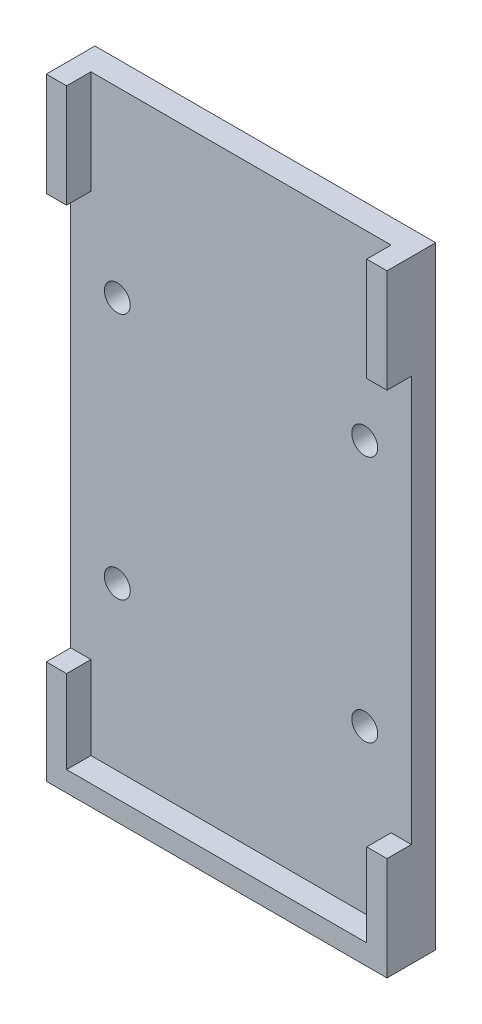
ISO-10303-21;
HEADER;
FILE_DESCRIPTION(('STEP AP214'),'2;1');
FILE_NAME('part.step','',(''),(''),'','','');
FILE_SCHEMA(('AUTOMOTIVE_DESIGN { 1 0 10303 214 1 1 1 1 }'));
ENDSEC;
DATA;
#1=APPLICATION_CONTEXT('core data for automotive mechanical design processes');
#2=APPLICATION_PROTOCOL_DEFINITION('international standard','automotive_design',2000,#1);
#3=PRODUCT_CONTEXT('',#1,'mechanical');
#4=PRODUCT('Part','Part','',(#3));
#5=PRODUCT_RELATED_PRODUCT_CATEGORY('part','',(#4));
#6=PRODUCT_DEFINITION_FORMATION('','',#4);
#7=PRODUCT_DEFINITION_CONTEXT('part definition',#1,'design');
#8=PRODUCT_DEFINITION('design','',#6,#7);
#9=PRODUCT_DEFINITION_SHAPE('','',#8);
#10=(LENGTH_UNIT() NAMED_UNIT(*) SI_UNIT(.MILLI.,.METRE.));
#11=(NAMED_UNIT(*) PLANE_ANGLE_UNIT() SI_UNIT($,.RADIAN.));
#12=(NAMED_UNIT(*) SI_UNIT($,.STERADIAN.) SOLID_ANGLE_UNIT());
#13=UNCERTAINTY_MEASURE_WITH_UNIT(LENGTH_MEASURE(1.E-05),#10,'distance_accuracy_value','');
#14=(GEOMETRIC_REPRESENTATION_CONTEXT(3) GLOBAL_UNCERTAINTY_ASSIGNED_CONTEXT((#13)) GLOBAL_UNIT_ASSIGNED_CONTEXT((#10,
#11,#12)) REPRESENTATION_CONTEXT('',''));
#15=CARTESIAN_POINT('',(0.,0.,0.));
#16=DIRECTION('',(0.,0.,1.));
#17=DIRECTION('',(1.,0.,0.));
#18=AXIS2_PLACEMENT_3D('',#15,#16,#17);
#19=CARTESIAN_POINT('',(0.,0.,3.));
#20=DIRECTION('',(0.,0.,-1.));
#21=DIRECTION('',(-1.,0.,0.));
#22=AXIS2_PLACEMENT_3D('',#19,#20,#21);
#23=PLANE('',#22);
#24=DIRECTION('',(-1.,0.,0.));
#25=VECTOR('',#24,1.);
#26=CARTESIAN_POINT('',(39.5,10.25,3.));
#27=LINE('',#26,#25);
#28=CARTESIAN_POINT('',(39.5,10.25,3.));
#29=VERTEX_POINT('',#28);
#30=CARTESIAN_POINT('',(37.,10.25,3.));
#31=VERTEX_POINT('',#30);
#32=EDGE_CURVE('E157',#29,#31,#27,.T.);
#33=ORIENTED_EDGE('',*,*,#32,.T.);
#34=DIRECTION('',(0.,-1.,0.));
#35=VECTOR('',#34,1.);
#36=CARTESIAN_POINT('',(37.,0.,3.));
#37=LINE('',#36,#35);
#38=CARTESIAN_POINT('',(37.,0.,3.));
#39=VERTEX_POINT('',#38);
#40=EDGE_CURVE('E255',#31,#39,#37,.T.);
#41=ORIENTED_EDGE('',*,*,#40,.T.);
#42=DIRECTION('',(-1.,0.,0.));
#43=VECTOR('',#42,1.);
#44=CARTESIAN_POINT('',(0.,0.,3.));
#45=LINE('',#44,#43);
#46=CARTESIAN_POINT('',(0.,0.,3.));
#47=VERTEX_POINT('',#46);
#48=EDGE_CURVE('E259',#39,#47,#45,.T.);
#49=ORIENTED_EDGE('',*,*,#48,.T.);
#50=DIRECTION('',(0.,1.,0.));
#51=VECTOR('',#50,1.);
#52=CARTESIAN_POINT('',(0.,0.,3.));
#53=LINE('',#52,#51);
#54=CARTESIAN_POINT('',(0.,10.25,3.));
#55=VERTEX_POINT('',#54);
#56=EDGE_CURVE('E235',#47,#55,#53,.T.);
#57=ORIENTED_EDGE('',*,*,#56,.T.);
#58=DIRECTION('',(1.,0.,0.));
#59=VECTOR('',#58,1.);
#60=CARTESIAN_POINT('',(-2.5,10.25,3.));
#61=LINE('',#60,#59);
#62=CARTESIAN_POINT('',(-2.5,10.25,3.));
#63=VERTEX_POINT('',#62);
#64=EDGE_CURVE('E151',#63,#55,#61,.T.);
#65=ORIENTED_EDGE('',*,*,#64,.F.);
#66=DIRECTION('',(0.,1.,0.));
#67=VECTOR('',#66,1.);
#68=CARTESIAN_POINT('',(-2.5,0.,3.));
#69=LINE('',#68,#67);
#70=CARTESIAN_POINT('',(-2.5,-2.5,3.));
#71=VERTEX_POINT('',#70);
#72=EDGE_CURVE('E243',#71,#63,#69,.T.);
#73=ORIENTED_EDGE('',*,*,#72,.F.);
#74=DIRECTION('',(1.,0.,0.));
#75=VECTOR('',#74,1.);
#76=CARTESIAN_POINT('',(0.,-2.5,3.));
#77=LINE('',#76,#75);
#78=CARTESIAN_POINT('',(39.5,-2.5,3.));
#79=VERTEX_POINT('',#78);
#80=EDGE_CURVE('E246',#79,#71,#77,.F.);
#81=ORIENTED_EDGE('',*,*,#80,.F.);
#82=DIRECTION('',(0.,1.,0.));
#83=VECTOR('',#82,1.);
#84=CARTESIAN_POINT('',(39.5,0.,3.));
#85=LINE('',#84,#83);
#86=EDGE_CURVE('E249',#29,#79,#85,.F.);
#87=ORIENTED_EDGE('',*,*,#86,.F.);
#88=EDGE_LOOP('',(#33,#41,#49,#57,#65,#73,#81,#87));
#89=FACE_BOUND('',#88,.T.);
#90=ADVANCED_FACE('F32',(#89),#23,.F.);
#91=DIRECTION('',(1.,0.,0.));
#92=VECTOR('',#91,1.);
#93=CARTESIAN_POINT('',(39.5,60.25,3.));
#94=LINE('',#93,#92);
#95=CARTESIAN_POINT('',(37.,60.25,3.));
#96=VERTEX_POINT('',#95);
#97=CARTESIAN_POINT('',(39.5,60.25,3.));
#98=VERTEX_POINT('',#97);
#99=EDGE_CURVE('E166',#96,#98,#94,.T.);
#100=ORIENTED_EDGE('',*,*,#99,.T.);
#101=CARTESIAN_POINT('',(39.5,73.,3.));
#102=VERTEX_POINT('',#101);
#103=EDGE_CURVE('E250',#102,#98,#85,.F.);
#104=ORIENTED_EDGE('',*,*,#103,.F.);
#105=DIRECTION('',(1.,0.,0.));
#106=VECTOR('',#105,1.);
#107=CARTESIAN_POINT('',(37.,73.,3.));
#108=LINE('',#107,#106);
#109=CARTESIAN_POINT('',(37.,73.,3.));
#110=VERTEX_POINT('',#109);
#111=EDGE_CURVE('E252',#110,#102,#108,.T.);
#112=ORIENTED_EDGE('',*,*,#111,.F.);
#113=EDGE_CURVE('E256',#110,#96,#37,.T.);
#114=ORIENTED_EDGE('',*,*,#113,.T.);
#115=EDGE_LOOP('',(#100,#104,#112,#114));
#116=FACE_BOUND('',#115,.T.);
#117=ADVANCED_FACE('F302',(#116),#23,.F.);
#118=CARTESIAN_POINT('',(39.5,0.,3.));
#119=DIRECTION('',(1.,0.,0.));
#120=DIRECTION('',(0.,0.,-1.));
#121=AXIS2_PLACEMENT_3D('',#118,#119,#120);
#122=PLANE('',#121);
#123=DIRECTION('',(0.,-1.,0.));
#124=VECTOR('',#123,1.);
#125=CARTESIAN_POINT('',(39.5,10.25,0.));
#126=LINE('',#125,#124);
#127=CARTESIAN_POINT('',(39.5,60.25,0.));
#128=VERTEX_POINT('',#127);
#129=CARTESIAN_POINT('',(39.5,10.25,0.));
#130=VERTEX_POINT('',#129);
#131=EDGE_CURVE('E146',#128,#130,#126,.T.);
#132=ORIENTED_EDGE('',*,*,#131,.T.);
#133=DIRECTION('',(0.,0.,1.));
#134=VECTOR('',#133,1.);
#135=CARTESIAN_POINT('',(39.5,10.25,-50.062460986252));
#136=LINE('',#135,#134);
#137=EDGE_CURVE('E154',#130,#29,#136,.T.);
#138=ORIENTED_EDGE('',*,*,#137,.T.);
#139=ORIENTED_EDGE('',*,*,#86,.T.);
#140=DIRECTION('',(0.,0.,-1.));
#141=VECTOR('',#140,1.);
#142=CARTESIAN_POINT('',(39.5,-2.5,3.));
#143=LINE('',#142,#141);
#144=CARTESIAN_POINT('',(39.5,-2.5,-3.));
#145=VERTEX_POINT('',#144);
#146=EDGE_CURVE('E281',#79,#145,#143,.T.);
#147=ORIENTED_EDGE('',*,*,#146,.T.);
#148=DIRECTION('',(0.,-1.,0.));
#149=VECTOR('',#148,1.);
#150=CARTESIAN_POINT('',(39.5,73.,-3.));
#151=LINE('',#150,#149);
#152=CARTESIAN_POINT('',(39.5,73.,-3.));
#153=VERTEX_POINT('',#152);
#154=EDGE_CURVE('E220',#153,#145,#151,.T.);
#155=ORIENTED_EDGE('',*,*,#154,.F.);
#156=DIRECTION('',(0.,0.,-1.));
#157=VECTOR('',#156,1.);
#158=CARTESIAN_POINT('',(39.5,73.,3.));
#159=LINE('',#158,#157);
#160=EDGE_CURVE('E279',#102,#153,#159,.T.);
#161=ORIENTED_EDGE('',*,*,#160,.F.);
#162=ORIENTED_EDGE('',*,*,#103,.T.);
#163=DIRECTION('',(0.,0.,1.));
#164=VECTOR('',#163,1.);
#165=CARTESIAN_POINT('',(39.5,60.25,-50.062460986252));
#166=LINE('',#165,#164);
#167=EDGE_CURVE('E160',#128,#98,#166,.T.);
#168=ORIENTED_EDGE('',*,*,#167,.F.);
#169=EDGE_LOOP('',(#132,#138,#139,#147,#155,#161,#162,#168));
#170=FACE_BOUND('',#169,.T.);
#171=ADVANCED_FACE('F163',(#170),#122,.T.);
#172=CARTESIAN_POINT('',(37.,0.,3.));
#173=DIRECTION('',(1.,0.,0.));
#174=DIRECTION('',(0.,0.,-1.));
#175=AXIS2_PLACEMENT_3D('',#172,#173,#174);
#176=PLANE('',#175);
#177=DIRECTION('',(0.,0.,1.));
#178=VECTOR('',#177,1.);
#179=CARTESIAN_POINT('',(37.,10.25,-50.062460986252));
#180=LINE('',#179,#178);
#181=CARTESIAN_POINT('',(37.,10.25,0.));
#182=VERTEX_POINT('',#181);
#183=EDGE_CURVE('E170',#182,#31,#180,.T.);
#184=ORIENTED_EDGE('',*,*,#183,.F.);
#185=DIRECTION('',(0.,-1.,0.));
#186=VECTOR('',#185,1.);
#187=CARTESIAN_POINT('',(37.,0.,0.));
#188=LINE('',#187,#186);
#189=CARTESIAN_POINT('',(37.,0.,0.));
#190=VERTEX_POINT('',#189);
#191=EDGE_CURVE('E148',#182,#190,#188,.T.);
#192=ORIENTED_EDGE('',*,*,#191,.T.);
#193=DIRECTION('',(0.,0.,-1.));
#194=VECTOR('',#193,1.);
#195=CARTESIAN_POINT('',(37.,0.,3.));
#196=LINE('',#195,#194);
#197=EDGE_CURVE('E273',#39,#190,#196,.T.);
#198=ORIENTED_EDGE('',*,*,#197,.F.);
#199=ORIENTED_EDGE('',*,*,#40,.F.);
#200=EDGE_LOOP('',(#184,#192,#198,#199));
#201=FACE_BOUND('',#200,.T.);
#202=ADVANCED_FACE('F311',(#201),#176,.F.);
#203=DIRECTION('',(0.,0.,1.));
#204=VECTOR('',#203,1.);
#205=CARTESIAN_POINT('',(37.,60.25,-50.062460986252));
#206=LINE('',#205,#204);
#207=CARTESIAN_POINT('',(37.,60.25,0.));
#208=VERTEX_POINT('',#207);
#209=EDGE_CURVE('E172',#208,#96,#206,.T.);
#210=ORIENTED_EDGE('',*,*,#209,.T.);
#211=ORIENTED_EDGE('',*,*,#113,.F.);
#212=DIRECTION('',(0.,0.,-1.));
#213=VECTOR('',#212,1.);
#214=CARTESIAN_POINT('',(37.,73.,3.));
#215=LINE('',#214,#213);
#216=CARTESIAN_POINT('',(37.,73.,0.));
#217=VERTEX_POINT('',#216);
#218=EDGE_CURVE('E276',#110,#217,#215,.T.);
#219=ORIENTED_EDGE('',*,*,#218,.T.);
#220=EDGE_CURVE('E265',#217,#208,#188,.T.);
#221=ORIENTED_EDGE('',*,*,#220,.T.);
#222=EDGE_LOOP('',(#210,#211,#219,#221));
#223=FACE_BOUND('',#222,.T.);
#224=ADVANCED_FACE('F359',(#223),#176,.F.);
#225=CARTESIAN_POINT('',(0.,0.,3.));
#226=DIRECTION('',(-1.,0.,0.));
#227=DIRECTION('',(0.,0.,1.));
#228=AXIS2_PLACEMENT_3D('',#225,#226,#227);
#229=PLANE('',#228);
#230=DIRECTION('',(0.,1.,0.));
#231=VECTOR('',#230,1.);
#232=CARTESIAN_POINT('',(0.,0.,0.));
#233=LINE('',#232,#231);
#234=CARTESIAN_POINT('',(0.,0.,0.));
#235=VERTEX_POINT('',#234);
#236=CARTESIAN_POINT('',(0.,10.25,0.));
#237=VERTEX_POINT('',#236);
#238=EDGE_CURVE('E262',#235,#237,#233,.T.);
#239=ORIENTED_EDGE('',*,*,#238,.T.);
#240=DIRECTION('',(0.,0.,1.));
#241=VECTOR('',#240,1.);
#242=CARTESIAN_POINT('',(0.,10.25,-50.062460986252));
#243=LINE('',#242,#241);
#244=EDGE_CURVE('E180',#237,#55,#243,.T.);
#245=ORIENTED_EDGE('',*,*,#244,.T.);
#246=ORIENTED_EDGE('',*,*,#56,.F.);
#247=DIRECTION('',(0.,0.,-1.));
#248=VECTOR('',#247,1.);
#249=CARTESIAN_POINT('',(0.,0.,3.));
#250=LINE('',#249,#248);
#251=EDGE_CURVE('E261',#47,#235,#250,.T.);
#252=ORIENTED_EDGE('',*,*,#251,.T.);
#253=EDGE_LOOP('',(#239,#245,#246,#252));
#254=FACE_BOUND('',#253,.T.);
#255=ADVANCED_FACE('F320',(#254),#229,.F.);
#256=CARTESIAN_POINT('',(0.,60.25,3.));
#257=VERTEX_POINT('',#256);
#258=CARTESIAN_POINT('',(0.,73.,3.));
#259=VERTEX_POINT('',#258);
#260=EDGE_CURVE('E239',#257,#259,#53,.T.);
#261=ORIENTED_EDGE('',*,*,#260,.F.);
#262=DIRECTION('',(0.,0.,1.));
#263=VECTOR('',#262,1.);
#264=CARTESIAN_POINT('',(0.,60.25,-50.062460986252));
#265=LINE('',#264,#263);
#266=CARTESIAN_POINT('',(0.,60.25,0.));
#267=VERTEX_POINT('',#266);
#268=EDGE_CURVE('E188',#267,#257,#265,.T.);
#269=ORIENTED_EDGE('',*,*,#268,.F.);
#270=CARTESIAN_POINT('',(0.,73.,0.));
#271=VERTEX_POINT('',#270);
#272=EDGE_CURVE('E232',#267,#271,#233,.T.);
#273=ORIENTED_EDGE('',*,*,#272,.T.);
#274=DIRECTION('',(0.,0.,-1.));
#275=VECTOR('',#274,1.);
#276=CARTESIAN_POINT('',(0.,73.,3.));
#277=LINE('',#276,#275);
#278=EDGE_CURVE('E11',#259,#271,#277,.T.);
#279=ORIENTED_EDGE('',*,*,#278,.F.);
#280=EDGE_LOOP('',(#261,#269,#273,#279));
#281=FACE_BOUND('',#280,.T.);
#282=ADVANCED_FACE('F34',(#281),#229,.F.);
#283=CARTESIAN_POINT('',(-2.5,0.,3.));
#284=DIRECTION('',(-1.,0.,0.));
#285=DIRECTION('',(0.,0.,1.));
#286=AXIS2_PLACEMENT_3D('',#283,#284,#285);
#287=PLANE('',#286);
#288=DIRECTION('',(0.,0.,1.));
#289=VECTOR('',#288,1.);
#290=CARTESIAN_POINT('',(-2.5,10.25,-50.062460986252));
#291=LINE('',#290,#289);
#292=CARTESIAN_POINT('',(-2.5,10.25,0.));
#293=VERTEX_POINT('',#292);
#294=EDGE_CURVE('E183',#293,#63,#291,.T.);
#295=ORIENTED_EDGE('',*,*,#294,.F.);
#296=DIRECTION('',(0.,-1.,0.));
#297=VECTOR('',#296,1.);
#298=CARTESIAN_POINT('',(-2.5,10.25,0.));
#299=LINE('',#298,#297);
#300=CARTESIAN_POINT('',(-2.5,60.25,0.));
#301=VERTEX_POINT('',#300);
#302=EDGE_CURVE('E181',#301,#293,#299,.T.);
#303=ORIENTED_EDGE('',*,*,#302,.F.);
#304=DIRECTION('',(0.,0.,1.));
#305=VECTOR('',#304,1.);
#306=CARTESIAN_POINT('',(-2.5,60.25,-50.062460986252));
#307=LINE('',#306,#305);
#308=CARTESIAN_POINT('',(-2.5,60.25,3.));
#309=VERTEX_POINT('',#308);
#310=EDGE_CURVE('E184',#301,#309,#307,.T.);
#311=ORIENTED_EDGE('',*,*,#310,.T.);
#312=CARTESIAN_POINT('',(-2.5,73.,3.));
#313=VERTEX_POINT('',#312);
#314=EDGE_CURVE('E242',#309,#313,#69,.T.);
#315=ORIENTED_EDGE('',*,*,#314,.T.);
#316=DIRECTION('',(0.,0.,-1.));
#317=VECTOR('',#316,1.);
#318=CARTESIAN_POINT('',(-2.5,73.,3.));
#319=LINE('',#318,#317);
#320=CARTESIAN_POINT('',(-2.5,73.,-3.));
#321=VERTEX_POINT('',#320);
#322=EDGE_CURVE('E40',#313,#321,#319,.T.);
#323=ORIENTED_EDGE('',*,*,#322,.T.);
#324=DIRECTION('',(0.,1.,0.));
#325=VECTOR('',#324,1.);
#326=CARTESIAN_POINT('',(-2.5,-2.5,-3.));
#327=LINE('',#326,#325);
#328=CARTESIAN_POINT('',(-2.5,-2.5,-3.));
#329=VERTEX_POINT('',#328);
#330=EDGE_CURVE('E226',#329,#321,#327,.T.);
#331=ORIENTED_EDGE('',*,*,#330,.F.);
#332=DIRECTION('',(0.,0.,-1.));
#333=VECTOR('',#332,1.);
#334=CARTESIAN_POINT('',(-2.5,-2.5,3.));
#335=LINE('',#334,#333);
#336=EDGE_CURVE('E283',#71,#329,#335,.T.);
#337=ORIENTED_EDGE('',*,*,#336,.F.);
#338=ORIENTED_EDGE('',*,*,#72,.T.);
#339=EDGE_LOOP('',(#295,#303,#311,#315,#323,#331,#337,#338));
#340=FACE_BOUND('',#339,.T.);
#341=ADVANCED_FACE('F288',(#340),#287,.T.);
#342=CARTESIAN_POINT('',(0.,-2.5,3.));
#343=DIRECTION('',(0.,-1.,0.));
#344=DIRECTION('',(0.,0.,-1.));
#345=AXIS2_PLACEMENT_3D('',#342,#343,#344);
#346=PLANE('',#345);
#347=ORIENTED_EDGE('',*,*,#336,.T.);
#348=DIRECTION('',(-1.,0.,0.));
#349=VECTOR('',#348,1.);
#350=CARTESIAN_POINT('',(39.5,-2.5,-3.));
#351=LINE('',#350,#349);
#352=EDGE_CURVE('E223',#145,#329,#351,.T.);
#353=ORIENTED_EDGE('',*,*,#352,.F.);
#354=ORIENTED_EDGE('',*,*,#146,.F.);
#355=ORIENTED_EDGE('',*,*,#80,.T.);
#356=EDGE_LOOP('',(#347,#353,#354,#355));
#357=FACE_BOUND('',#356,.T.);
#358=ADVANCED_FACE('F326',(#357),#346,.T.);
#359=CARTESIAN_POINT('',(37.,73.,3.));
#360=DIRECTION('',(0.,1.,0.));
#361=DIRECTION('',(0.,0.,1.));
#362=AXIS2_PLACEMENT_3D('',#359,#360,#361);
#363=PLANE('',#362);
#364=ORIENTED_EDGE('',*,*,#160,.T.);
#365=DIRECTION('',(1.,0.,0.));
#366=VECTOR('',#365,1.);
#367=CARTESIAN_POINT('',(39.5,73.,-3.));
#368=LINE('',#367,#366);
#369=EDGE_CURVE('E229',#321,#153,#368,.T.);
#370=ORIENTED_EDGE('',*,*,#369,.F.);
#371=ORIENTED_EDGE('',*,*,#322,.F.);
#372=DIRECTION('',(1.,0.,0.));
#373=VECTOR('',#372,1.);
#374=CARTESIAN_POINT('',(-2.5,73.,3.));
#375=LINE('',#374,#373);
#376=EDGE_CURVE('E238',#313,#259,#375,.T.);
#377=ORIENTED_EDGE('',*,*,#376,.T.);
#378=ORIENTED_EDGE('',*,*,#278,.T.);
#379=DIRECTION('',(1.,0.,0.));
#380=VECTOR('',#379,1.);
#381=CARTESIAN_POINT('',(39.5,73.,0.));
#382=LINE('',#381,#380);
#383=EDGE_CURVE('E219',#271,#217,#382,.T.);
#384=ORIENTED_EDGE('',*,*,#383,.T.);
#385=ORIENTED_EDGE('',*,*,#218,.F.);
#386=ORIENTED_EDGE('',*,*,#111,.T.);
#387=EDGE_LOOP('',(#364,#370,#371,#377,#378,#384,#385,#386));
#388=FACE_BOUND('',#387,.T.);
#389=ADVANCED_FACE('F297',(#388),#363,.T.);
#390=CARTESIAN_POINT('',(0.,0.,3.));
#391=DIRECTION('',(0.,-1.,0.));
#392=DIRECTION('',(0.,0.,-1.));
#393=AXIS2_PLACEMENT_3D('',#390,#391,#392);
#394=PLANE('',#393);
#395=DIRECTION('',(-1.,0.,0.));
#396=VECTOR('',#395,1.);
#397=CARTESIAN_POINT('',(0.,0.,0.));
#398=LINE('',#397,#396);
#399=EDGE_CURVE('E268',#190,#235,#398,.T.);
#400=ORIENTED_EDGE('',*,*,#399,.T.);
#401=ORIENTED_EDGE('',*,*,#251,.F.);
#402=ORIENTED_EDGE('',*,*,#48,.F.);
#403=ORIENTED_EDGE('',*,*,#197,.T.);
#404=EDGE_LOOP('',(#400,#401,#402,#403));
#405=FACE_BOUND('',#404,.T.);
#406=ADVANCED_FACE('F315',(#405),#394,.F.);
#407=ORIENTED_EDGE('',*,*,#314,.F.);
#408=DIRECTION('',(-1.,0.,0.));
#409=VECTOR('',#408,1.);
#410=CARTESIAN_POINT('',(-2.5,60.25,3.));
#411=LINE('',#410,#409);
#412=EDGE_CURVE('E176',#257,#309,#411,.T.);
#413=ORIENTED_EDGE('',*,*,#412,.F.);
#414=ORIENTED_EDGE('',*,*,#260,.T.);
#415=ORIENTED_EDGE('',*,*,#376,.F.);
#416=EDGE_LOOP('',(#407,#413,#414,#415));
#417=FACE_BOUND('',#416,.T.);
#418=ADVANCED_FACE('F337',(#417),#23,.F.);
#419=CARTESIAN_POINT('',(0.,0.,-3.));
#420=DIRECTION('',(0.,0.,-1.));
#421=DIRECTION('',(-1.,0.,0.));
#422=AXIS2_PLACEMENT_3D('',#419,#420,#421);
#423=PLANE('',#422);
#424=CARTESIAN_POINT('',(3.25,50.5,-3.));
#425=DIRECTION('',(0.,0.,1.));
#426=DIRECTION('',(1.,0.,0.));
#427=AXIS2_PLACEMENT_3D('',#424,#425,#426);
#428=CIRCLE('',#427,1.6);
#429=CARTESIAN_POINT('',(4.85,50.5,-3.));
#430=VERTEX_POINT('',#429);
#431=EDGE_CURVE('E198',#430,#430,#428,.T.);
#432=ORIENTED_EDGE('',*,*,#431,.T.);
#433=EDGE_LOOP('',(#432));
#434=FACE_BOUND('',#433,.T.);
#435=CARTESIAN_POINT('',(33.75,50.5,-3.));
#436=DIRECTION('',(0.,0.,1.));
#437=DIRECTION('',(1.,0.,0.));
#438=AXIS2_PLACEMENT_3D('',#435,#436,#437);
#439=CIRCLE('',#438,1.6);
#440=CARTESIAN_POINT('',(35.35,50.5,-3.));
#441=VERTEX_POINT('',#440);
#442=EDGE_CURVE('E204',#441,#441,#439,.T.);
#443=ORIENTED_EDGE('',*,*,#442,.T.);
#444=EDGE_LOOP('',(#443));
#445=FACE_BOUND('',#444,.T.);
#446=CARTESIAN_POINT('',(33.75,20.,-3.));
#447=DIRECTION('',(0.,0.,1.));
#448=DIRECTION('',(1.,0.,0.));
#449=AXIS2_PLACEMENT_3D('',#446,#447,#448);
#450=CIRCLE('',#449,1.6);
#451=CARTESIAN_POINT('',(35.35,20.,-3.));
#452=VERTEX_POINT('',#451);
#453=EDGE_CURVE('E210',#452,#452,#450,.T.);
#454=ORIENTED_EDGE('',*,*,#453,.T.);
#455=EDGE_LOOP('',(#454));
#456=FACE_BOUND('',#455,.T.);
#457=CARTESIAN_POINT('',(3.25000000000001,20.,-3.));
#458=DIRECTION('',(0.,0.,1.));
#459=DIRECTION('',(1.,0.,0.));
#460=AXIS2_PLACEMENT_3D('',#457,#458,#459);
#461=CIRCLE('',#460,1.6);
#462=CARTESIAN_POINT('',(4.85,20.,-3.));
#463=VERTEX_POINT('',#462);
#464=EDGE_CURVE('E216',#463,#463,#461,.T.);
#465=ORIENTED_EDGE('',*,*,#464,.T.);
#466=EDGE_LOOP('',(#465));
#467=FACE_BOUND('',#466,.T.);
#468=ORIENTED_EDGE('',*,*,#154,.T.);
#469=ORIENTED_EDGE('',*,*,#352,.T.);
#470=ORIENTED_EDGE('',*,*,#330,.T.);
#471=ORIENTED_EDGE('',*,*,#369,.T.);
#472=EDGE_LOOP('',(#468,#469,#470,#471));
#473=FACE_BOUND('',#472,.T.);
#474=ADVANCED_FACE('F294',(#434,#445,#456,#467,#473),#423,.T.);
#475=CARTESIAN_POINT('',(0.,0.,0.));
#476=DIRECTION('',(0.,0.,-1.));
#477=DIRECTION('',(-1.,0.,0.));
#478=AXIS2_PLACEMENT_3D('',#475,#476,#477);
#479=PLANE('',#478);
#480=CARTESIAN_POINT('',(3.25,50.5,0.));
#481=DIRECTION('',(0.,0.,1.));
#482=DIRECTION('',(1.,0.,0.));
#483=AXIS2_PLACEMENT_3D('',#480,#481,#482);
#484=CIRCLE('',#483,1.59999999999999);
#485=CARTESIAN_POINT('',(4.84999999999999,50.5,0.));
#486=VERTEX_POINT('',#485);
#487=EDGE_CURVE('E195',#486,#486,#484,.T.);
#488=ORIENTED_EDGE('',*,*,#487,.F.);
#489=EDGE_LOOP('',(#488));
#490=FACE_BOUND('',#489,.T.);
#491=CARTESIAN_POINT('',(33.75,50.5,0.));
#492=DIRECTION('',(0.,0.,1.));
#493=DIRECTION('',(1.,0.,0.));
#494=AXIS2_PLACEMENT_3D('',#491,#492,#493);
#495=CIRCLE('',#494,1.59999999999999);
#496=CARTESIAN_POINT('',(35.35,50.5,0.));
#497=VERTEX_POINT('',#496);
#498=EDGE_CURVE('E201',#497,#497,#495,.T.);
#499=ORIENTED_EDGE('',*,*,#498,.F.);
#500=EDGE_LOOP('',(#499));
#501=FACE_BOUND('',#500,.T.);
#502=CARTESIAN_POINT('',(33.75,20.,0.));
#503=DIRECTION('',(0.,0.,1.));
#504=DIRECTION('',(1.,0.,0.));
#505=AXIS2_PLACEMENT_3D('',#502,#503,#504);
#506=CIRCLE('',#505,1.59999999999998);
#507=CARTESIAN_POINT('',(35.35,20.,0.));
#508=VERTEX_POINT('',#507);
#509=EDGE_CURVE('E207',#508,#508,#506,.T.);
#510=ORIENTED_EDGE('',*,*,#509,.F.);
#511=EDGE_LOOP('',(#510));
#512=FACE_BOUND('',#511,.T.);
#513=CARTESIAN_POINT('',(3.25000000000001,20.,0.));
#514=DIRECTION('',(0.,0.,1.));
#515=DIRECTION('',(1.,0.,0.));
#516=AXIS2_PLACEMENT_3D('',#513,#514,#515);
#517=CIRCLE('',#516,1.59999999999999);
#518=CARTESIAN_POINT('',(4.84999999999999,20.,0.));
#519=VERTEX_POINT('',#518);
#520=EDGE_CURVE('E213',#519,#519,#517,.T.);
#521=ORIENTED_EDGE('',*,*,#520,.F.);
#522=EDGE_LOOP('',(#521));
#523=FACE_BOUND('',#522,.T.);
#524=ORIENTED_EDGE('',*,*,#238,.F.);
#525=ORIENTED_EDGE('',*,*,#399,.F.);
#526=ORIENTED_EDGE('',*,*,#191,.F.);
#527=DIRECTION('',(-1.,0.,0.));
#528=VECTOR('',#527,1.);
#529=CARTESIAN_POINT('',(39.5,10.25,0.));
#530=LINE('',#529,#528);
#531=EDGE_CURVE('E142',#130,#182,#530,.T.);
#532=ORIENTED_EDGE('',*,*,#531,.F.);
#533=ORIENTED_EDGE('',*,*,#131,.F.);
#534=DIRECTION('',(1.,0.,0.));
#535=VECTOR('',#534,1.);
#536=CARTESIAN_POINT('',(39.5,60.25,0.));
#537=LINE('',#536,#535);
#538=EDGE_CURVE('E47',#208,#128,#537,.T.);
#539=ORIENTED_EDGE('',*,*,#538,.F.);
#540=ORIENTED_EDGE('',*,*,#220,.F.);
#541=ORIENTED_EDGE('',*,*,#383,.F.);
#542=ORIENTED_EDGE('',*,*,#272,.F.);
#543=DIRECTION('',(-1.,0.,0.));
#544=VECTOR('',#543,1.);
#545=CARTESIAN_POINT('',(-2.5,60.25,0.));
#546=LINE('',#545,#544);
#547=EDGE_CURVE('E185',#267,#301,#546,.T.);
#548=ORIENTED_EDGE('',*,*,#547,.T.);
#549=ORIENTED_EDGE('',*,*,#302,.T.);
#550=DIRECTION('',(1.,0.,0.));
#551=VECTOR('',#550,1.);
#552=CARTESIAN_POINT('',(-2.5,10.25,0.));
#553=LINE('',#552,#551);
#554=EDGE_CURVE('E54',#293,#237,#553,.T.);
#555=ORIENTED_EDGE('',*,*,#554,.T.);
#556=EDGE_LOOP('',(#524,#525,#526,#532,#533,#539,#540,#541,#542,#548,#549,#555));
#557=FACE_BOUND('',#556,.T.);
#558=ADVANCED_FACE('F144',(#490,#501,#512,#523,#557),#479,.F.);
#559=CARTESIAN_POINT('',(3.25000000000001,20.,0.));
#560=DIRECTION('',(0.,0.,1.));
#561=DIRECTION('',(1.,0.,0.));
#562=AXIS2_PLACEMENT_3D('',#559,#560,#561);
#563=CYLINDRICAL_SURFACE('',#562,1.59999999999999);
#564=ORIENTED_EDGE('',*,*,#464,.F.);
#565=EDGE_LOOP('',(#564));
#566=FACE_BOUND('',#565,.T.);
#567=ORIENTED_EDGE('',*,*,#520,.T.);
#568=EDGE_LOOP('',(#567));
#569=FACE_BOUND('',#568,.T.);
#570=ADVANCED_FACE('F385',(#566,#569),#563,.F.);
#571=CARTESIAN_POINT('',(33.75,20.,0.));
#572=DIRECTION('',(0.,0.,1.));
#573=DIRECTION('',(1.,0.,0.));
#574=AXIS2_PLACEMENT_3D('',#571,#572,#573);
#575=CYLINDRICAL_SURFACE('',#574,1.59999999999999);
#576=ORIENTED_EDGE('',*,*,#453,.F.);
#577=EDGE_LOOP('',(#576));
#578=FACE_BOUND('',#577,.T.);
#579=ORIENTED_EDGE('',*,*,#509,.T.);
#580=EDGE_LOOP('',(#579));
#581=FACE_BOUND('',#580,.T.);
#582=ADVANCED_FACE('F381',(#578,#581),#575,.F.);
#583=CARTESIAN_POINT('',(33.75,50.5,0.));
#584=DIRECTION('',(0.,0.,1.));
#585=DIRECTION('',(1.,0.,0.));
#586=AXIS2_PLACEMENT_3D('',#583,#584,#585);
#587=CYLINDRICAL_SURFACE('',#586,1.59999999999999);
#588=ORIENTED_EDGE('',*,*,#442,.F.);
#589=EDGE_LOOP('',(#588));
#590=FACE_BOUND('',#589,.T.);
#591=ORIENTED_EDGE('',*,*,#498,.T.);
#592=EDGE_LOOP('',(#591));
#593=FACE_BOUND('',#592,.T.);
#594=ADVANCED_FACE('F377',(#590,#593),#587,.F.);
#595=CARTESIAN_POINT('',(3.25,50.5,0.));
#596=DIRECTION('',(0.,0.,1.));
#597=DIRECTION('',(1.,0.,0.));
#598=AXIS2_PLACEMENT_3D('',#595,#596,#597);
#599=CYLINDRICAL_SURFACE('',#598,1.59999999999999);
#600=ORIENTED_EDGE('',*,*,#431,.F.);
#601=EDGE_LOOP('',(#600));
#602=FACE_BOUND('',#601,.T.);
#603=ORIENTED_EDGE('',*,*,#487,.T.);
#604=EDGE_LOOP('',(#603));
#605=FACE_BOUND('',#604,.T.);
#606=ADVANCED_FACE('F374',(#602,#605),#599,.F.);
#607=CARTESIAN_POINT('',(-2.5,10.25,-50.062460986252));
#608=DIRECTION('',(0.,-1.,0.));
#609=DIRECTION('',(1.,0.,0.));
#610=AXIS2_PLACEMENT_3D('',#607,#608,#609);
#611=PLANE('',#610);
#612=ORIENTED_EDGE('',*,*,#294,.T.);
#613=ORIENTED_EDGE('',*,*,#64,.T.);
#614=ORIENTED_EDGE('',*,*,#244,.F.);
#615=ORIENTED_EDGE('',*,*,#554,.F.);
#616=EDGE_LOOP('',(#612,#613,#614,#615));
#617=FACE_BOUND('',#616,.T.);
#618=ADVANCED_FACE('F322',(#617),#611,.F.);
#619=CARTESIAN_POINT('',(-2.5,60.25,-50.062460986252));
#620=DIRECTION('',(0.,1.,0.));
#621=DIRECTION('',(0.,0.,1.));
#622=AXIS2_PLACEMENT_3D('',#619,#620,#621);
#623=PLANE('',#622);
#624=ORIENTED_EDGE('',*,*,#268,.T.);
#625=ORIENTED_EDGE('',*,*,#412,.T.);
#626=ORIENTED_EDGE('',*,*,#310,.F.);
#627=ORIENTED_EDGE('',*,*,#547,.F.);
#628=EDGE_LOOP('',(#624,#625,#626,#627));
#629=FACE_BOUND('',#628,.T.);
#630=ADVANCED_FACE('F366',(#629),#623,.F.);
#631=CARTESIAN_POINT('',(39.5,10.25,-50.062460986252));
#632=DIRECTION('',(0.,1.,0.));
#633=DIRECTION('',(-1.,0.,0.));
#634=AXIS2_PLACEMENT_3D('',#631,#632,#633);
#635=PLANE('',#634);
#636=ORIENTED_EDGE('',*,*,#531,.T.);
#637=ORIENTED_EDGE('',*,*,#183,.T.);
#638=ORIENTED_EDGE('',*,*,#32,.F.);
#639=ORIENTED_EDGE('',*,*,#137,.F.);
#640=EDGE_LOOP('',(#636,#637,#638,#639));
#641=FACE_BOUND('',#640,.T.);
#642=ADVANCED_FACE('F155',(#641),#635,.T.);
#643=CARTESIAN_POINT('',(39.5,60.25,-50.062460986252));
#644=DIRECTION('',(0.,-1.,0.));
#645=DIRECTION('',(0.,0.,-1.));
#646=AXIS2_PLACEMENT_3D('',#643,#644,#645);
#647=PLANE('',#646);
#648=ORIENTED_EDGE('',*,*,#538,.T.);
#649=ORIENTED_EDGE('',*,*,#167,.T.);
#650=ORIENTED_EDGE('',*,*,#99,.F.);
#651=ORIENTED_EDGE('',*,*,#209,.F.);
#652=EDGE_LOOP('',(#648,#649,#650,#651));
#653=FACE_BOUND('',#652,.T.);
#654=ADVANCED_FACE('F360',(#653),#647,.T.);
#655=CLOSED_SHELL('',(#90,#117,#171,#202,#224,#255,#282,#341,#358,#389,#406,#418,#474,#558,#570,
#582,#594,#606,#618,#630,#642,#654));
#656=MANIFOLD_SOLID_BREP('B2',#655);
#657=ADVANCED_BREP_SHAPE_REPRESENTATION('',(#18,#656),#14);
#658=SHAPE_DEFINITION_REPRESENTATION(#9,#657);
ENDSEC;
END-ISO-10303-21;
